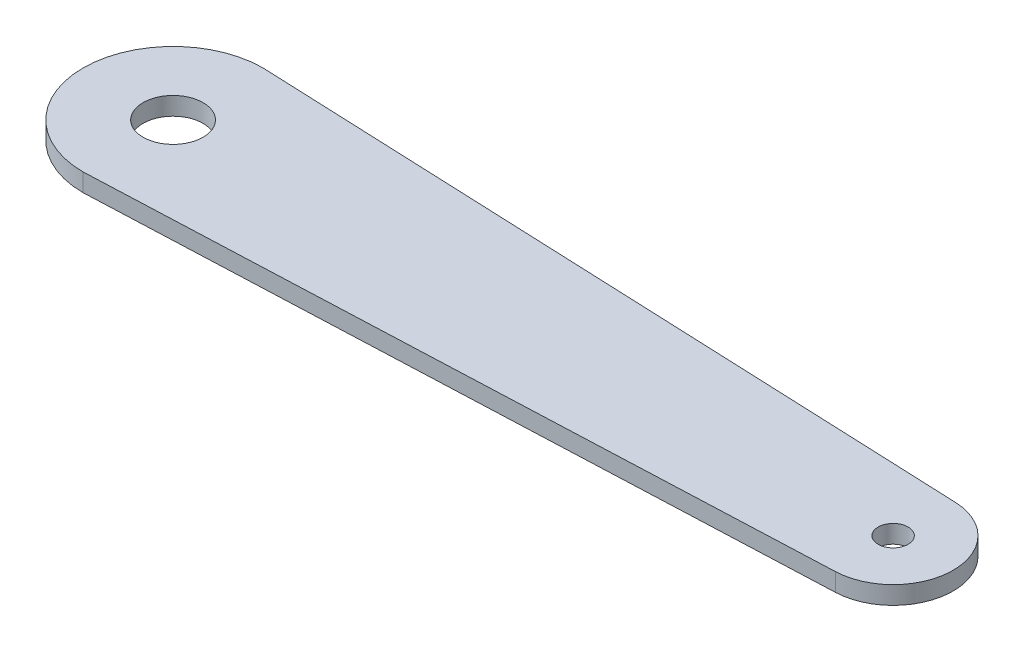
ISO-10303-21;
HEADER;
FILE_DESCRIPTION(('STEP AP214'),'2;1');
FILE_NAME('part.step','',(''),(''),'','','');
FILE_SCHEMA(('AUTOMOTIVE_DESIGN { 1 0 10303 214 1 1 1 1 }'));
ENDSEC;
DATA;
#1=APPLICATION_CONTEXT('core data for automotive mechanical design processes');
#2=APPLICATION_PROTOCOL_DEFINITION('international standard','automotive_design',2000,#1);
#3=PRODUCT_CONTEXT('',#1,'mechanical');
#4=PRODUCT('Part','Part','',(#3));
#5=PRODUCT_RELATED_PRODUCT_CATEGORY('part','',(#4));
#6=PRODUCT_DEFINITION_FORMATION('','',#4);
#7=PRODUCT_DEFINITION_CONTEXT('part definition',#1,'design');
#8=PRODUCT_DEFINITION('design','',#6,#7);
#9=PRODUCT_DEFINITION_SHAPE('','',#8);
#10=(LENGTH_UNIT() NAMED_UNIT(*) SI_UNIT(.MILLI.,.METRE.));
#11=(NAMED_UNIT(*) PLANE_ANGLE_UNIT() SI_UNIT($,.RADIAN.));
#12=(NAMED_UNIT(*) SI_UNIT($,.STERADIAN.) SOLID_ANGLE_UNIT());
#13=UNCERTAINTY_MEASURE_WITH_UNIT(LENGTH_MEASURE(1.E-05),#10,'distance_accuracy_value','');
#14=(GEOMETRIC_REPRESENTATION_CONTEXT(3) GLOBAL_UNCERTAINTY_ASSIGNED_CONTEXT((#13)) GLOBAL_UNIT_ASSIGNED_CONTEXT((#10,
#11,#12)) REPRESENTATION_CONTEXT('',''));
#15=CARTESIAN_POINT('',(0.,0.,0.));
#16=DIRECTION('',(0.,0.,1.));
#17=DIRECTION('',(1.,0.,0.));
#18=AXIS2_PLACEMENT_3D('',#15,#16,#17);
#19=CARTESIAN_POINT('',(0.622841562175591,3.,14.9740931482305));
#20=DIRECTION('',(-0.0415586748019892,0.,-0.99913606508258));
#21=DIRECTION('',(-0.999136065082581,0.,0.0415586748019892));
#22=AXIS2_PLACEMENT_3D('',#19,#20,#21);
#23=PLANE('',#22);
#24=DIRECTION('',(0.999136065082581,0.,-0.0415586748019892));
#25=VECTOR('',#24,1.);
#26=CARTESIAN_POINT('',(0.622841562175591,0.,14.9740931482305));
#27=LINE('',#26,#25);
#28=CARTESIAN_POINT('',(0.,0.,15.));
#29=VERTEX_POINT('',#28);
#30=CARTESIAN_POINT('',(120.41558674802,0.,9.99136065082581));
#31=VERTEX_POINT('',#30);
#32=EDGE_CURVE('E119',#29,#31,#27,.T.);
#33=ORIENTED_EDGE('',*,*,#32,.T.);
#34=DIRECTION('',(0.,-1.,0.));
#35=VECTOR('',#34,1.);
#36=CARTESIAN_POINT('',(120.41558674802,3.,9.99136065082581));
#37=LINE('',#36,#35);
#38=CARTESIAN_POINT('',(120.41558674802,3.,9.99136065082581));
#39=VERTEX_POINT('',#38);
#40=EDGE_CURVE('E11',#39,#31,#37,.T.);
#41=ORIENTED_EDGE('',*,*,#40,.F.);
#42=DIRECTION('',(0.999136065082581,0.,-0.0415586748019892));
#43=VECTOR('',#42,1.);
#44=CARTESIAN_POINT('',(0.622841562175591,3.,14.9740931482305));
#45=LINE('',#44,#43);
#46=CARTESIAN_POINT('',(0.,3.,15.));
#47=VERTEX_POINT('',#46);
#48=EDGE_CURVE('E96',#47,#39,#45,.T.);
#49=ORIENTED_EDGE('',*,*,#48,.F.);
#50=DIRECTION('',(0.,-1.,0.));
#51=VECTOR('',#50,1.);
#52=CARTESIAN_POINT('',(0.,3.,15.));
#53=LINE('',#52,#51);
#54=EDGE_CURVE('E118',#47,#29,#53,.T.);
#55=ORIENTED_EDGE('',*,*,#54,.T.);
#56=EDGE_LOOP('',(#33,#41,#49,#55));
#57=FACE_BOUND('',#56,.T.);
#58=ADVANCED_FACE('F47',(#57),#23,.F.);
#59=CARTESIAN_POINT('',(120.,3.,0.));
#60=DIRECTION('',(0.,-1.,0.));
#61=DIRECTION('',(0.,0.,-1.));
#62=AXIS2_PLACEMENT_3D('',#59,#60,#61);
#63=CYLINDRICAL_SURFACE('',#62,10.);
#64=CARTESIAN_POINT('',(120.,0.,0.));
#65=DIRECTION('',(0.,1.,0.));
#66=DIRECTION('',(0.,0.,1.));
#67=AXIS2_PLACEMENT_3D('',#64,#65,#66);
#68=CIRCLE('',#67,10.);
#69=CARTESIAN_POINT('',(120.41558674802,0.,-9.99136065082581));
#70=VERTEX_POINT('',#69);
#71=EDGE_CURVE('E102',#31,#70,#68,.T.);
#72=ORIENTED_EDGE('',*,*,#71,.T.);
#73=DIRECTION('',(0.,-1.,0.));
#74=VECTOR('',#73,1.);
#75=CARTESIAN_POINT('',(120.41558674802,3.,-9.99136065082581));
#76=LINE('',#75,#74);
#77=CARTESIAN_POINT('',(120.41558674802,3.,-9.99136065082581));
#78=VERTEX_POINT('',#77);
#79=EDGE_CURVE('E56',#78,#70,#76,.T.);
#80=ORIENTED_EDGE('',*,*,#79,.F.);
#81=CARTESIAN_POINT('',(120.,3.,0.));
#82=DIRECTION('',(0.,1.,0.));
#83=DIRECTION('',(0.,0.,1.));
#84=AXIS2_PLACEMENT_3D('',#81,#82,#83);
#85=CIRCLE('',#84,10.);
#86=EDGE_CURVE('E90',#39,#78,#85,.T.);
#87=ORIENTED_EDGE('',*,*,#86,.F.);
#88=ORIENTED_EDGE('',*,*,#40,.T.);
#89=EDGE_LOOP('',(#72,#80,#87,#88));
#90=FACE_BOUND('',#89,.T.);
#91=ADVANCED_FACE('F101',(#90),#63,.T.);
#92=CARTESIAN_POINT('',(0.622841562175591,3.,-14.9740931482305));
#93=DIRECTION('',(0.0415586748019892,0.,-0.99913606508258));
#94=DIRECTION('',(-0.999136065082581,0.,-0.0415586748019892));
#95=AXIS2_PLACEMENT_3D('',#92,#93,#94);
#96=PLANE('',#95);
#97=DIRECTION('',(0.999136065082581,0.,0.0415586748019892));
#98=VECTOR('',#97,1.);
#99=CARTESIAN_POINT('',(0.622841562175591,0.,-14.9740931482305));
#100=LINE('',#99,#98);
#101=CARTESIAN_POINT('',(0.,0.,-15.));
#102=VERTEX_POINT('',#101);
#103=EDGE_CURVE('E126',#102,#70,#100,.T.);
#104=ORIENTED_EDGE('',*,*,#103,.F.);
#105=DIRECTION('',(0.,-1.,0.));
#106=VECTOR('',#105,1.);
#107=CARTESIAN_POINT('',(0.,3.,-15.));
#108=LINE('',#107,#106);
#109=CARTESIAN_POINT('',(0.,3.,-15.));
#110=VERTEX_POINT('',#109);
#111=EDGE_CURVE('E80',#110,#102,#108,.T.);
#112=ORIENTED_EDGE('',*,*,#111,.F.);
#113=DIRECTION('',(0.999136065082581,0.,0.0415586748019892));
#114=VECTOR('',#113,1.);
#115=CARTESIAN_POINT('',(0.622841562175591,3.,-14.9740931482305));
#116=LINE('',#115,#114);
#117=EDGE_CURVE('E94',#110,#78,#116,.T.);
#118=ORIENTED_EDGE('',*,*,#117,.T.);
#119=ORIENTED_EDGE('',*,*,#79,.T.);
#120=EDGE_LOOP('',(#104,#112,#118,#119));
#121=FACE_BOUND('',#120,.T.);
#122=ADVANCED_FACE('F107',(#121),#96,.T.);
#123=CARTESIAN_POINT('',(0.,3.,0.));
#124=DIRECTION('',(0.,-1.,0.));
#125=DIRECTION('',(0.,0.,-1.));
#126=AXIS2_PLACEMENT_3D('',#123,#124,#125);
#127=CYLINDRICAL_SURFACE('',#126,15.);
#128=CARTESIAN_POINT('',(0.,0.,0.));
#129=DIRECTION('',(0.,1.,0.));
#130=DIRECTION('',(0.,0.,1.));
#131=AXIS2_PLACEMENT_3D('',#128,#129,#130);
#132=CIRCLE('',#131,15.);
#133=EDGE_CURVE('E83',#102,#29,#132,.T.);
#134=ORIENTED_EDGE('',*,*,#133,.T.);
#135=ORIENTED_EDGE('',*,*,#54,.F.);
#136=CARTESIAN_POINT('',(0.,3.,0.));
#137=DIRECTION('',(0.,1.,0.));
#138=DIRECTION('',(0.,0.,1.));
#139=AXIS2_PLACEMENT_3D('',#136,#137,#138);
#140=CIRCLE('',#139,15.);
#141=EDGE_CURVE('E64',#110,#47,#140,.T.);
#142=ORIENTED_EDGE('',*,*,#141,.F.);
#143=ORIENTED_EDGE('',*,*,#111,.T.);
#144=EDGE_LOOP('',(#134,#135,#142,#143));
#145=FACE_BOUND('',#144,.T.);
#146=ADVANCED_FACE('F151',(#145),#127,.T.);
#147=CARTESIAN_POINT('',(0.,3.,0.));
#148=DIRECTION('',(0.,-1.,0.));
#149=DIRECTION('',(0.,0.,-1.));
#150=AXIS2_PLACEMENT_3D('',#147,#148,#149);
#151=CYLINDRICAL_SURFACE('',#150,5.);
#152=CARTESIAN_POINT('',(0.,3.,0.));
#153=DIRECTION('',(0.,1.,0.));
#154=DIRECTION('',(0.,0.,1.));
#155=AXIS2_PLACEMENT_3D('',#152,#153,#154);
#156=CIRCLE('',#155,5.);
#157=CARTESIAN_POINT('',(0.,3.,5.));
#158=VERTEX_POINT('',#157);
#159=EDGE_CURVE('E111',#158,#158,#156,.T.);
#160=ORIENTED_EDGE('',*,*,#159,.T.);
#161=EDGE_LOOP('',(#160));
#162=FACE_BOUND('',#161,.T.);
#163=CARTESIAN_POINT('',(0.,0.,0.));
#164=DIRECTION('',(0.,1.,0.));
#165=DIRECTION('',(0.,0.,1.));
#166=AXIS2_PLACEMENT_3D('',#163,#164,#165);
#167=CIRCLE('',#166,5.);
#168=CARTESIAN_POINT('',(0.,0.,5.));
#169=VERTEX_POINT('',#168);
#170=EDGE_CURVE('E131',#169,#169,#167,.T.);
#171=ORIENTED_EDGE('',*,*,#170,.F.);
#172=EDGE_LOOP('',(#171));
#173=FACE_BOUND('',#172,.T.);
#174=ADVANCED_FACE('F149',(#162,#173),#151,.F.);
#175=CARTESIAN_POINT('',(0.,3.,0.));
#176=DIRECTION('',(0.,1.,0.));
#177=DIRECTION('',(0.,0.,1.));
#178=AXIS2_PLACEMENT_3D('',#175,#176,#177);
#179=PLANE('',#178);
#180=CARTESIAN_POINT('',(120.,3.,0.));
#181=DIRECTION('',(0.,1.,0.));
#182=DIRECTION('',(0.,0.,1.));
#183=AXIS2_PLACEMENT_3D('',#180,#181,#182);
#184=CIRCLE('',#183,2.5);
#185=CARTESIAN_POINT('',(120.,3.,2.5));
#186=VERTEX_POINT('',#185);
#187=EDGE_CURVE('E228',#186,#186,#184,.T.);
#188=ORIENTED_EDGE('',*,*,#187,.F.);
#189=EDGE_LOOP('',(#188));
#190=FACE_BOUND('',#189,.T.);
#191=ORIENTED_EDGE('',*,*,#48,.T.);
#192=ORIENTED_EDGE('',*,*,#86,.T.);
#193=ORIENTED_EDGE('',*,*,#117,.F.);
#194=ORIENTED_EDGE('',*,*,#141,.T.);
#195=EDGE_LOOP('',(#191,#192,#193,#194));
#196=FACE_BOUND('',#195,.T.);
#197=ORIENTED_EDGE('',*,*,#159,.F.);
#198=EDGE_LOOP('',(#197));
#199=FACE_BOUND('',#198,.T.);
#200=ADVANCED_FACE('F91',(#190,#196,#199),#179,.T.);
#201=CARTESIAN_POINT('',(0.,0.,0.));
#202=DIRECTION('',(0.,1.,0.));
#203=DIRECTION('',(0.,0.,1.));
#204=AXIS2_PLACEMENT_3D('',#201,#202,#203);
#205=PLANE('',#204);
#206=CARTESIAN_POINT('',(120.,0.,0.));
#207=DIRECTION('',(0.,1.,0.));
#208=DIRECTION('',(0.,0.,1.));
#209=AXIS2_PLACEMENT_3D('',#206,#207,#208);
#210=CIRCLE('',#209,2.5);
#211=CARTESIAN_POINT('',(120.,0.,2.5));
#212=VERTEX_POINT('',#211);
#213=EDGE_CURVE('E123',#212,#212,#210,.T.);
#214=ORIENTED_EDGE('',*,*,#213,.T.);
#215=EDGE_LOOP('',(#214));
#216=FACE_BOUND('',#215,.T.);
#217=ORIENTED_EDGE('',*,*,#32,.F.);
#218=ORIENTED_EDGE('',*,*,#133,.F.);
#219=ORIENTED_EDGE('',*,*,#103,.T.);
#220=ORIENTED_EDGE('',*,*,#71,.F.);
#221=EDGE_LOOP('',(#217,#218,#219,#220));
#222=FACE_BOUND('',#221,.T.);
#223=ORIENTED_EDGE('',*,*,#170,.T.);
#224=EDGE_LOOP('',(#223));
#225=FACE_BOUND('',#224,.T.);
#226=ADVANCED_FACE('F141',(#216,#222,#225),#205,.F.);
#227=CARTESIAN_POINT('',(120.,0.,0.));
#228=DIRECTION('',(0.,1.,0.));
#229=DIRECTION('',(0.,0.,1.));
#230=AXIS2_PLACEMENT_3D('',#227,#228,#229);
#231=CYLINDRICAL_SURFACE('',#230,2.5);
#232=ORIENTED_EDGE('',*,*,#213,.F.);
#233=EDGE_LOOP('',(#232));
#234=FACE_BOUND('',#233,.T.);
#235=ORIENTED_EDGE('',*,*,#187,.T.);
#236=EDGE_LOOP('',(#235));
#237=FACE_BOUND('',#236,.T.);
#238=ADVANCED_FACE('F144',(#234,#237),#231,.F.);
#239=CLOSED_SHELL('',(#58,#91,#122,#146,#174,#200,#226,#238));
#240=MANIFOLD_SOLID_BREP('B2',#239);
#241=ADVANCED_BREP_SHAPE_REPRESENTATION('',(#18,#240),#14);
#242=SHAPE_DEFINITION_REPRESENTATION(#9,#241);
ENDSEC;
END-ISO-10303-21;
